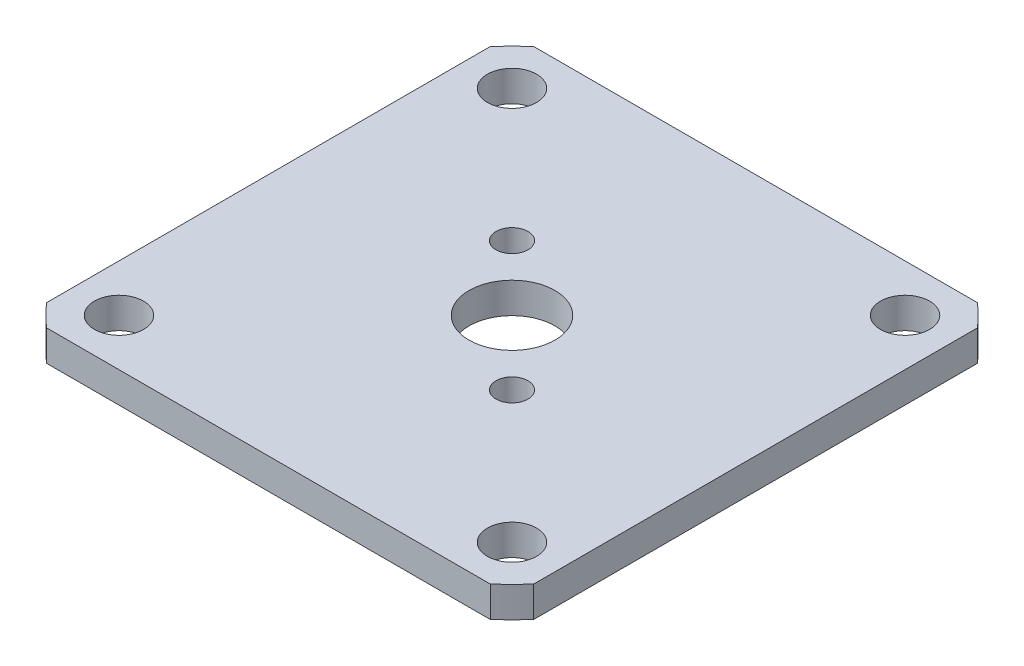
ISO-10303-21;
HEADER;
FILE_DESCRIPTION(('STEP AP214'),'2;1');
FILE_NAME('part.step','',(''),(''),'','','');
FILE_SCHEMA(('AUTOMOTIVE_DESIGN { 1 0 10303 214 1 1 1 1 }'));
ENDSEC;
DATA;
#1=APPLICATION_CONTEXT('core data for automotive mechanical design processes');
#2=APPLICATION_PROTOCOL_DEFINITION('international standard','automotive_design',2000,#1);
#3=PRODUCT_CONTEXT('',#1,'mechanical');
#4=PRODUCT('Part','Part','',(#3));
#5=PRODUCT_RELATED_PRODUCT_CATEGORY('part','',(#4));
#6=PRODUCT_DEFINITION_FORMATION('','',#4);
#7=PRODUCT_DEFINITION_CONTEXT('part definition',#1,'design');
#8=PRODUCT_DEFINITION('design','',#6,#7);
#9=PRODUCT_DEFINITION_SHAPE('','',#8);
#10=(LENGTH_UNIT() NAMED_UNIT(*) SI_UNIT(.MILLI.,.METRE.));
#11=(NAMED_UNIT(*) PLANE_ANGLE_UNIT() SI_UNIT($,.RADIAN.));
#12=(NAMED_UNIT(*) SI_UNIT($,.STERADIAN.) SOLID_ANGLE_UNIT());
#13=UNCERTAINTY_MEASURE_WITH_UNIT(LENGTH_MEASURE(1.E-05),#10,'distance_accuracy_value','');
#14=(GEOMETRIC_REPRESENTATION_CONTEXT(3) GLOBAL_UNCERTAINTY_ASSIGNED_CONTEXT((#13)) GLOBAL_UNIT_ASSIGNED_CONTEXT((#10,
#11,#12)) REPRESENTATION_CONTEXT('',''));
#15=CARTESIAN_POINT('',(0.,0.,0.));
#16=DIRECTION('',(0.,0.,1.));
#17=DIRECTION('',(1.,0.,0.));
#18=AXIS2_PLACEMENT_3D('',#15,#16,#17);
#19=CARTESIAN_POINT('',(0.,2.5,0.));
#20=DIRECTION('',(0.,-1.,0.));
#21=DIRECTION('',(0.,0.,-1.));
#22=AXIS2_PLACEMENT_3D('',#19,#20,#21);
#23=CYLINDRICAL_SURFACE('',#22,26.83);
#24=CARTESIAN_POINT('',(0.,2.5,0.));
#25=DIRECTION('',(0.,1.,0.));
#26=DIRECTION('',(0.,0.,1.));
#27=AXIS2_PLACEMENT_3D('',#24,#25,#26);
#28=CIRCLE('',#27,26.83);
#29=CARTESIAN_POINT('',(-19.8339359945665,2.5,18.0683115692485));
#30=VERTEX_POINT('',#29);
#31=CARTESIAN_POINT('',(-18.0683115692485,2.5,19.8339359945665));
#32=VERTEX_POINT('',#31);
#33=EDGE_CURVE('E122',#30,#32,#28,.T.);
#34=ORIENTED_EDGE('',*,*,#33,.F.);
#35=DIRECTION('',(0.,1.,0.));
#36=VECTOR('',#35,1.);
#37=CARTESIAN_POINT('',(-19.8339359945665,-7.5,18.0683115692485));
#38=LINE('',#37,#36);
#39=CARTESIAN_POINT('',(-19.8339359945665,0.,18.0683115692485));
#40=VERTEX_POINT('',#39);
#41=EDGE_CURVE('E106',#40,#30,#38,.T.);
#42=ORIENTED_EDGE('',*,*,#41,.F.);
#43=CARTESIAN_POINT('',(0.,0.,0.));
#44=DIRECTION('',(0.,1.,0.));
#45=DIRECTION('',(0.,0.,1.));
#46=AXIS2_PLACEMENT_3D('',#43,#44,#45);
#47=CIRCLE('',#46,26.83);
#48=CARTESIAN_POINT('',(-18.0683115692485,0.,19.8339359945665));
#49=VERTEX_POINT('',#48);
#50=EDGE_CURVE('E222',#40,#49,#47,.T.);
#51=ORIENTED_EDGE('',*,*,#50,.T.);
#52=DIRECTION('',(0.,1.,0.));
#53=VECTOR('',#52,1.);
#54=CARTESIAN_POINT('',(-18.0683115692485,-7.5,19.8339359945665));
#55=LINE('',#54,#53);
#56=EDGE_CURVE('E59',#49,#32,#55,.T.);
#57=ORIENTED_EDGE('',*,*,#56,.T.);
#58=EDGE_LOOP('',(#34,#42,#51,#57));
#59=FACE_BOUND('',#58,.T.);
#60=ADVANCED_FACE('F41',(#59),#23,.T.);
#61=CARTESIAN_POINT('',(-18.0683115692485,0.,-19.8339359945665));
#62=VERTEX_POINT('',#61);
#63=CARTESIAN_POINT('',(-19.8339359945665,0.,-18.0683115692485));
#64=VERTEX_POINT('',#63);
#65=EDGE_CURVE('E227',#62,#64,#47,.T.);
#66=ORIENTED_EDGE('',*,*,#65,.T.);
#67=DIRECTION('',(0.,1.,0.));
#68=VECTOR('',#67,1.);
#69=CARTESIAN_POINT('',(-19.8339359945665,-7.5,-18.0683115692485));
#70=LINE('',#69,#68);
#71=CARTESIAN_POINT('',(-19.8339359945665,2.5,-18.0683115692485));
#72=VERTEX_POINT('',#71);
#73=EDGE_CURVE('E67',#64,#72,#70,.T.);
#74=ORIENTED_EDGE('',*,*,#73,.T.);
#75=CARTESIAN_POINT('',(-18.0683115692485,2.5,-19.8339359945665));
#76=VERTEX_POINT('',#75);
#77=EDGE_CURVE('E125',#76,#72,#28,.T.);
#78=ORIENTED_EDGE('',*,*,#77,.F.);
#79=DIRECTION('',(0.,1.,0.));
#80=VECTOR('',#79,1.);
#81=CARTESIAN_POINT('',(-18.0683115692485,-7.5,-19.8339359945665));
#82=LINE('',#81,#80);
#83=EDGE_CURVE('E164',#62,#76,#82,.T.);
#84=ORIENTED_EDGE('',*,*,#83,.F.);
#85=EDGE_LOOP('',(#66,#74,#78,#84));
#86=FACE_BOUND('',#85,.T.);
#87=ADVANCED_FACE('F287',(#86),#23,.T.);
#88=DIRECTION('',(0.,1.,0.));
#89=VECTOR('',#88,1.);
#90=CARTESIAN_POINT('',(19.8339359945665,-7.5,18.0683115692485));
#91=LINE('',#90,#89);
#92=CARTESIAN_POINT('',(19.8339359945665,0.,18.0683115692485));
#93=VERTEX_POINT('',#92);
#94=CARTESIAN_POINT('',(19.8339359945665,2.5,18.0683115692485));
#95=VERTEX_POINT('',#94);
#96=EDGE_CURVE('E172',#93,#95,#91,.T.);
#97=ORIENTED_EDGE('',*,*,#96,.T.);
#98=CARTESIAN_POINT('',(18.0683115692485,2.5,19.8339359945665));
#99=VERTEX_POINT('',#98);
#100=EDGE_CURVE('E132',#99,#95,#28,.T.);
#101=ORIENTED_EDGE('',*,*,#100,.F.);
#102=DIRECTION('',(0.,1.,0.));
#103=VECTOR('',#102,1.);
#104=CARTESIAN_POINT('',(18.0683115692485,-7.5,19.8339359945665));
#105=LINE('',#104,#103);
#106=CARTESIAN_POINT('',(18.0683115692485,0.,19.8339359945665));
#107=VERTEX_POINT('',#106);
#108=EDGE_CURVE('E173',#107,#99,#105,.T.);
#109=ORIENTED_EDGE('',*,*,#108,.F.);
#110=EDGE_CURVE('E191',#107,#93,#47,.T.);
#111=ORIENTED_EDGE('',*,*,#110,.T.);
#112=EDGE_LOOP('',(#97,#101,#109,#111));
#113=FACE_BOUND('',#112,.T.);
#114=ADVANCED_FACE('F292',(#113),#23,.T.);
#115=CARTESIAN_POINT('',(19.8339359945665,0.,-18.0683115692485));
#116=VERTEX_POINT('',#115);
#117=CARTESIAN_POINT('',(18.0683115692485,0.,-19.8339359945665));
#118=VERTEX_POINT('',#117);
#119=EDGE_CURVE('E160',#116,#118,#47,.T.);
#120=ORIENTED_EDGE('',*,*,#119,.T.);
#121=DIRECTION('',(0.,1.,0.));
#122=VECTOR('',#121,1.);
#123=CARTESIAN_POINT('',(18.0683115692485,-7.5,-19.8339359945665));
#124=LINE('',#123,#122);
#125=CARTESIAN_POINT('',(18.0683115692485,2.5,-19.8339359945665));
#126=VERTEX_POINT('',#125);
#127=EDGE_CURVE('E127',#118,#126,#124,.T.);
#128=ORIENTED_EDGE('',*,*,#127,.T.);
#129=CARTESIAN_POINT('',(19.8339359945665,2.5,-18.0683115692485));
#130=VERTEX_POINT('',#129);
#131=EDGE_CURVE('E135',#130,#126,#28,.T.);
#132=ORIENTED_EDGE('',*,*,#131,.F.);
#133=DIRECTION('',(0.,1.,0.));
#134=VECTOR('',#133,1.);
#135=CARTESIAN_POINT('',(19.8339359945665,-7.5,-18.0683115692485));
#136=LINE('',#135,#134);
#137=EDGE_CURVE('E158',#116,#130,#136,.T.);
#138=ORIENTED_EDGE('',*,*,#137,.F.);
#139=EDGE_LOOP('',(#120,#128,#132,#138));
#140=FACE_BOUND('',#139,.T.);
#141=ADVANCED_FACE('F157',(#140),#23,.T.);
#142=CARTESIAN_POINT('',(0.,2.5,0.));
#143=DIRECTION('',(0.,1.,0.));
#144=DIRECTION('',(0.,0.,1.));
#145=AXIS2_PLACEMENT_3D('',#142,#143,#144);
#146=PLANE('',#145);
#147=CARTESIAN_POINT('',(-5.26243008694653,2.5,-5.26243008694652));
#148=DIRECTION('',(0.,1.,0.));
#149=DIRECTION('',(0.,0.,1.));
#150=AXIS2_PLACEMENT_3D('',#147,#148,#149);
#151=CIRCLE('',#150,1.3);
#152=CARTESIAN_POINT('',(-5.26243008694653,2.5,-3.96243008694652));
#153=VERTEX_POINT('',#152);
#154=EDGE_CURVE('E242',#153,#153,#151,.T.);
#155=ORIENTED_EDGE('',*,*,#154,.F.);
#156=EDGE_LOOP('',(#155));
#157=FACE_BOUND('',#156,.T.);
#158=CARTESIAN_POINT('',(5.26243008694652,2.5,5.26243008694652));
#159=DIRECTION('',(0.,1.,0.));
#160=DIRECTION('',(0.,0.,1.));
#161=AXIS2_PLACEMENT_3D('',#158,#159,#160);
#162=CIRCLE('',#161,1.3);
#163=CARTESIAN_POINT('',(5.26243008694652,2.5,6.56243008694652));
#164=VERTEX_POINT('',#163);
#165=EDGE_CURVE('E249',#164,#164,#162,.T.);
#166=ORIENTED_EDGE('',*,*,#165,.F.);
#167=EDGE_LOOP('',(#166));
#168=FACE_BOUND('',#167,.T.);
#169=DIRECTION('',(0.,0.,-1.));
#170=VECTOR('',#169,1.);
#171=CARTESIAN_POINT('',(-19.8339359945665,2.5,0.));
#172=LINE('',#171,#170);
#173=EDGE_CURVE('E109',#30,#72,#172,.T.);
#174=ORIENTED_EDGE('',*,*,#173,.F.);
#175=ORIENTED_EDGE('',*,*,#33,.T.);
#176=DIRECTION('',(1.,0.,0.));
#177=VECTOR('',#176,1.);
#178=CARTESIAN_POINT('',(0.,2.5,19.8339359945665));
#179=LINE('',#178,#177);
#180=EDGE_CURVE('E179',#32,#99,#179,.T.);
#181=ORIENTED_EDGE('',*,*,#180,.T.);
#182=ORIENTED_EDGE('',*,*,#100,.T.);
#183=DIRECTION('',(0.,0.,-1.));
#184=VECTOR('',#183,1.);
#185=CARTESIAN_POINT('',(19.8339359945665,2.5,0.));
#186=LINE('',#185,#184);
#187=EDGE_CURVE('E152',#95,#130,#186,.T.);
#188=ORIENTED_EDGE('',*,*,#187,.T.);
#189=ORIENTED_EDGE('',*,*,#131,.T.);
#190=DIRECTION('',(1.,0.,0.));
#191=VECTOR('',#190,1.);
#192=CARTESIAN_POINT('',(0.,2.5,-19.8339359945665));
#193=LINE('',#192,#191);
#194=EDGE_CURVE('E151',#76,#126,#193,.T.);
#195=ORIENTED_EDGE('',*,*,#194,.F.);
#196=ORIENTED_EDGE('',*,*,#77,.T.);
#197=EDGE_LOOP('',(#174,#175,#181,#182,#188,#189,#195,#196));
#198=FACE_BOUND('',#197,.T.);
#199=CARTESIAN_POINT('',(-16.0000000014358,2.5,16.0000000014358));
#200=DIRECTION('',(0.,1.,0.));
#201=DIRECTION('',(0.,0.,1.));
#202=AXIS2_PLACEMENT_3D('',#199,#200,#201);
#203=CIRCLE('',#202,2.);
#204=CARTESIAN_POINT('',(-16.0000000014358,2.5,18.0000000014358));
#205=VERTEX_POINT('',#204);
#206=EDGE_CURVE('E186',#205,#205,#203,.T.);
#207=ORIENTED_EDGE('',*,*,#206,.F.);
#208=EDGE_LOOP('',(#207));
#209=FACE_BOUND('',#208,.T.);
#210=CARTESIAN_POINT('',(16.0000000014358,2.5,-16.0000000014358));
#211=DIRECTION('',(0.,1.,0.));
#212=DIRECTION('',(0.,0.,1.));
#213=AXIS2_PLACEMENT_3D('',#210,#211,#212);
#214=CIRCLE('',#213,2.);
#215=CARTESIAN_POINT('',(16.0000000014358,2.5,-14.0000000014358));
#216=VERTEX_POINT('',#215);
#217=EDGE_CURVE('E190',#216,#216,#214,.T.);
#218=ORIENTED_EDGE('',*,*,#217,.F.);
#219=EDGE_LOOP('',(#218));
#220=FACE_BOUND('',#219,.T.);
#221=CARTESIAN_POINT('',(16.0000000014358,2.5,16.0000000014358));
#222=DIRECTION('',(0.,1.,0.));
#223=DIRECTION('',(0.,0.,1.));
#224=AXIS2_PLACEMENT_3D('',#221,#222,#223);
#225=CIRCLE('',#224,2.);
#226=CARTESIAN_POINT('',(16.0000000014358,2.5,18.0000000014358));
#227=VERTEX_POINT('',#226);
#228=EDGE_CURVE('E195',#227,#227,#225,.T.);
#229=ORIENTED_EDGE('',*,*,#228,.F.);
#230=EDGE_LOOP('',(#229));
#231=FACE_BOUND('',#230,.T.);
#232=CARTESIAN_POINT('',(-16.0000000014358,2.5,-16.0000000014358));
#233=DIRECTION('',(0.,1.,0.));
#234=DIRECTION('',(0.,0.,1.));
#235=AXIS2_PLACEMENT_3D('',#232,#233,#234);
#236=CIRCLE('',#235,2.);
#237=CARTESIAN_POINT('',(-16.0000000014358,2.5,-14.0000000014358));
#238=VERTEX_POINT('',#237);
#239=EDGE_CURVE('E137',#238,#238,#236,.T.);
#240=ORIENTED_EDGE('',*,*,#239,.F.);
#241=EDGE_LOOP('',(#240));
#242=FACE_BOUND('',#241,.T.);
#243=CARTESIAN_POINT('',(0.,2.5,0.));
#244=DIRECTION('',(0.,1.,0.));
#245=DIRECTION('',(0.,0.,1.));
#246=AXIS2_PLACEMENT_3D('',#243,#244,#245);
#247=CIRCLE('',#246,3.5);
#248=CARTESIAN_POINT('',(0.,2.5,3.5));
#249=VERTEX_POINT('',#248);
#250=EDGE_CURVE('E130',#249,#249,#247,.T.);
#251=ORIENTED_EDGE('',*,*,#250,.F.);
#252=EDGE_LOOP('',(#251));
#253=FACE_BOUND('',#252,.T.);
#254=ADVANCED_FACE('F119',(#157,#168,#198,#209,#220,#231,#242,#253),#146,.T.);
#255=CARTESIAN_POINT('',(0.,0.,0.));
#256=DIRECTION('',(0.,1.,0.));
#257=DIRECTION('',(0.,0.,1.));
#258=AXIS2_PLACEMENT_3D('',#255,#256,#257);
#259=PLANE('',#258);
#260=CARTESIAN_POINT('',(-5.26243008694653,0.,-5.26243008694652));
#261=DIRECTION('',(0.,1.,0.));
#262=DIRECTION('',(0.,0.,1.));
#263=AXIS2_PLACEMENT_3D('',#260,#261,#262);
#264=CIRCLE('',#263,1.3);
#265=CARTESIAN_POINT('',(-5.26243008694653,0.,-3.96243008694652));
#266=VERTEX_POINT('',#265);
#267=EDGE_CURVE('E45',#266,#266,#264,.T.);
#268=ORIENTED_EDGE('',*,*,#267,.T.);
#269=EDGE_LOOP('',(#268));
#270=FACE_BOUND('',#269,.T.);
#271=CARTESIAN_POINT('',(5.26243008694652,0.,5.26243008694652));
#272=DIRECTION('',(0.,1.,0.));
#273=DIRECTION('',(0.,0.,1.));
#274=AXIS2_PLACEMENT_3D('',#271,#272,#273);
#275=CIRCLE('',#274,1.3);
#276=CARTESIAN_POINT('',(5.26243008694652,0.,6.56243008694652));
#277=VERTEX_POINT('',#276);
#278=EDGE_CURVE('E239',#277,#277,#275,.T.);
#279=ORIENTED_EDGE('',*,*,#278,.T.);
#280=EDGE_LOOP('',(#279));
#281=FACE_BOUND('',#280,.T.);
#282=CARTESIAN_POINT('',(-16.0000000014358,0.,16.0000000014358));
#283=DIRECTION('',(0.,1.,0.));
#284=DIRECTION('',(0.,0.,1.));
#285=AXIS2_PLACEMENT_3D('',#282,#283,#284);
#286=CIRCLE('',#285,2.);
#287=CARTESIAN_POINT('',(-16.0000000014358,0.,18.0000000014358));
#288=VERTEX_POINT('',#287);
#289=EDGE_CURVE('E258',#288,#288,#286,.T.);
#290=ORIENTED_EDGE('',*,*,#289,.T.);
#291=EDGE_LOOP('',(#290));
#292=FACE_BOUND('',#291,.T.);
#293=CARTESIAN_POINT('',(16.0000000014358,0.,-16.0000000014358));
#294=DIRECTION('',(0.,1.,0.));
#295=DIRECTION('',(0.,0.,1.));
#296=AXIS2_PLACEMENT_3D('',#293,#294,#295);
#297=CIRCLE('',#296,2.);
#298=CARTESIAN_POINT('',(16.0000000014358,0.,-14.0000000014358));
#299=VERTEX_POINT('',#298);
#300=EDGE_CURVE('E263',#299,#299,#297,.T.);
#301=ORIENTED_EDGE('',*,*,#300,.T.);
#302=EDGE_LOOP('',(#301));
#303=FACE_BOUND('',#302,.T.);
#304=CARTESIAN_POINT('',(16.0000000014358,0.,16.0000000014358));
#305=DIRECTION('',(0.,1.,0.));
#306=DIRECTION('',(0.,0.,1.));
#307=AXIS2_PLACEMENT_3D('',#304,#305,#306);
#308=CIRCLE('',#307,2.);
#309=CARTESIAN_POINT('',(16.0000000014358,0.,18.0000000014358));
#310=VERTEX_POINT('',#309);
#311=EDGE_CURVE('E230',#310,#310,#308,.T.);
#312=ORIENTED_EDGE('',*,*,#311,.T.);
#313=EDGE_LOOP('',(#312));
#314=FACE_BOUND('',#313,.T.);
#315=CARTESIAN_POINT('',(-16.0000000014358,0.,-16.0000000014358));
#316=DIRECTION('',(0.,1.,0.));
#317=DIRECTION('',(0.,0.,1.));
#318=AXIS2_PLACEMENT_3D('',#315,#316,#317);
#319=CIRCLE('',#318,2.);
#320=CARTESIAN_POINT('',(-16.0000000014358,0.,-14.0000000014358));
#321=VERTEX_POINT('',#320);
#322=EDGE_CURVE('E223',#321,#321,#319,.T.);
#323=ORIENTED_EDGE('',*,*,#322,.T.);
#324=EDGE_LOOP('',(#323));
#325=FACE_BOUND('',#324,.T.);
#326=CARTESIAN_POINT('',(0.,0.,0.));
#327=DIRECTION('',(0.,1.,0.));
#328=DIRECTION('',(0.,0.,1.));
#329=AXIS2_PLACEMENT_3D('',#326,#327,#328);
#330=CIRCLE('',#329,3.5);
#331=CARTESIAN_POINT('',(0.,0.,3.5));
#332=VERTEX_POINT('',#331);
#333=EDGE_CURVE('E219',#332,#332,#330,.T.);
#334=ORIENTED_EDGE('',*,*,#333,.T.);
#335=EDGE_LOOP('',(#334));
#336=FACE_BOUND('',#335,.T.);
#337=ORIENTED_EDGE('',*,*,#50,.F.);
#338=DIRECTION('',(0.,0.,-1.));
#339=VECTOR('',#338,1.);
#340=CARTESIAN_POINT('',(-19.8339359945665,0.,0.));
#341=LINE('',#340,#339);
#342=EDGE_CURVE('E11',#40,#64,#341,.T.);
#343=ORIENTED_EDGE('',*,*,#342,.T.);
#344=ORIENTED_EDGE('',*,*,#65,.F.);
#345=DIRECTION('',(1.,0.,0.));
#346=VECTOR('',#345,1.);
#347=CARTESIAN_POINT('',(0.,0.,-19.8339359945665));
#348=LINE('',#347,#346);
#349=EDGE_CURVE('E51',#62,#118,#348,.T.);
#350=ORIENTED_EDGE('',*,*,#349,.T.);
#351=ORIENTED_EDGE('',*,*,#119,.F.);
#352=DIRECTION('',(0.,0.,-1.));
#353=VECTOR('',#352,1.);
#354=CARTESIAN_POINT('',(19.8339359945665,0.,0.));
#355=LINE('',#354,#353);
#356=EDGE_CURVE('E147',#93,#116,#355,.T.);
#357=ORIENTED_EDGE('',*,*,#356,.F.);
#358=ORIENTED_EDGE('',*,*,#110,.F.);
#359=DIRECTION('',(1.,0.,0.));
#360=VECTOR('',#359,1.);
#361=CARTESIAN_POINT('',(0.,0.,19.8339359945665));
#362=LINE('',#361,#360);
#363=EDGE_CURVE('E142',#49,#107,#362,.T.);
#364=ORIENTED_EDGE('',*,*,#363,.F.);
#365=EDGE_LOOP('',(#337,#343,#344,#350,#351,#357,#358,#364));
#366=FACE_BOUND('',#365,.T.);
#367=ADVANCED_FACE('F208',(#270,#281,#292,#303,#314,#325,#336,#366),#259,.F.);
#368=CARTESIAN_POINT('',(0.,2.5,0.));
#369=DIRECTION('',(0.,-1.,0.));
#370=DIRECTION('',(0.,0.,-1.));
#371=AXIS2_PLACEMENT_3D('',#368,#369,#370);
#372=CYLINDRICAL_SURFACE('',#371,3.5);
#373=ORIENTED_EDGE('',*,*,#250,.T.);
#374=EDGE_LOOP('',(#373));
#375=FACE_BOUND('',#374,.T.);
#376=ORIENTED_EDGE('',*,*,#333,.F.);
#377=EDGE_LOOP('',(#376));
#378=FACE_BOUND('',#377,.T.);
#379=ADVANCED_FACE('F213',(#375,#378),#372,.F.);
#380=CARTESIAN_POINT('',(-16.0000000014358,2.5,-16.0000000014358));
#381=DIRECTION('',(0.,-1.,0.));
#382=DIRECTION('',(0.,0.,-1.));
#383=AXIS2_PLACEMENT_3D('',#380,#381,#382);
#384=CYLINDRICAL_SURFACE('',#383,2.);
#385=ORIENTED_EDGE('',*,*,#239,.T.);
#386=EDGE_LOOP('',(#385));
#387=FACE_BOUND('',#386,.T.);
#388=ORIENTED_EDGE('',*,*,#322,.F.);
#389=EDGE_LOOP('',(#388));
#390=FACE_BOUND('',#389,.T.);
#391=ADVANCED_FACE('F203',(#387,#390),#384,.F.);
#392=CARTESIAN_POINT('',(16.0000000014358,2.5,16.0000000014358));
#393=DIRECTION('',(0.,-1.,0.));
#394=DIRECTION('',(0.,0.,-1.));
#395=AXIS2_PLACEMENT_3D('',#392,#393,#394);
#396=CYLINDRICAL_SURFACE('',#395,2.);
#397=ORIENTED_EDGE('',*,*,#228,.T.);
#398=EDGE_LOOP('',(#397));
#399=FACE_BOUND('',#398,.T.);
#400=ORIENTED_EDGE('',*,*,#311,.F.);
#401=EDGE_LOOP('',(#400));
#402=FACE_BOUND('',#401,.T.);
#403=ADVANCED_FACE('F275',(#399,#402),#396,.F.);
#404=CARTESIAN_POINT('',(16.0000000014358,2.5,-16.0000000014358));
#405=DIRECTION('',(0.,-1.,0.));
#406=DIRECTION('',(0.,0.,-1.));
#407=AXIS2_PLACEMENT_3D('',#404,#405,#406);
#408=CYLINDRICAL_SURFACE('',#407,2.);
#409=ORIENTED_EDGE('',*,*,#217,.T.);
#410=EDGE_LOOP('',(#409));
#411=FACE_BOUND('',#410,.T.);
#412=ORIENTED_EDGE('',*,*,#300,.F.);
#413=EDGE_LOOP('',(#412));
#414=FACE_BOUND('',#413,.T.);
#415=ADVANCED_FACE('F277',(#411,#414),#408,.F.);
#416=CARTESIAN_POINT('',(-16.0000000014358,2.5,16.0000000014358));
#417=DIRECTION('',(0.,-1.,0.));
#418=DIRECTION('',(0.,0.,-1.));
#419=AXIS2_PLACEMENT_3D('',#416,#417,#418);
#420=CYLINDRICAL_SURFACE('',#419,2.);
#421=ORIENTED_EDGE('',*,*,#206,.T.);
#422=EDGE_LOOP('',(#421));
#423=FACE_BOUND('',#422,.T.);
#424=ORIENTED_EDGE('',*,*,#289,.F.);
#425=EDGE_LOOP('',(#424));
#426=FACE_BOUND('',#425,.T.);
#427=ADVANCED_FACE('F43',(#423,#426),#420,.F.);
#428=CARTESIAN_POINT('',(0.,-7.5,19.8339359945665));
#429=DIRECTION('',(0.,0.,1.));
#430=DIRECTION('',(1.,0.,0.));
#431=AXIS2_PLACEMENT_3D('',#428,#429,#430);
#432=PLANE('',#431);
#433=ORIENTED_EDGE('',*,*,#363,.T.);
#434=ORIENTED_EDGE('',*,*,#108,.T.);
#435=ORIENTED_EDGE('',*,*,#180,.F.);
#436=ORIENTED_EDGE('',*,*,#56,.F.);
#437=EDGE_LOOP('',(#433,#434,#435,#436));
#438=FACE_BOUND('',#437,.T.);
#439=ADVANCED_FACE('F311',(#438),#432,.T.);
#440=CARTESIAN_POINT('',(19.8339359945665,-7.5,0.));
#441=DIRECTION('',(1.,0.,0.));
#442=DIRECTION('',(0.,0.,-1.));
#443=AXIS2_PLACEMENT_3D('',#440,#441,#442);
#444=PLANE('',#443);
#445=ORIENTED_EDGE('',*,*,#356,.T.);
#446=ORIENTED_EDGE('',*,*,#137,.T.);
#447=ORIENTED_EDGE('',*,*,#187,.F.);
#448=ORIENTED_EDGE('',*,*,#96,.F.);
#449=EDGE_LOOP('',(#445,#446,#447,#448));
#450=FACE_BOUND('',#449,.T.);
#451=ADVANCED_FACE('F305',(#450),#444,.T.);
#452=CARTESIAN_POINT('',(0.,-7.5,-19.8339359945665));
#453=DIRECTION('',(0.,0.,1.));
#454=DIRECTION('',(1.,0.,0.));
#455=AXIS2_PLACEMENT_3D('',#452,#453,#454);
#456=PLANE('',#455);
#457=ORIENTED_EDGE('',*,*,#83,.T.);
#458=ORIENTED_EDGE('',*,*,#194,.T.);
#459=ORIENTED_EDGE('',*,*,#127,.F.);
#460=ORIENTED_EDGE('',*,*,#349,.F.);
#461=EDGE_LOOP('',(#457,#458,#459,#460));
#462=FACE_BOUND('',#461,.T.);
#463=ADVANCED_FACE('F318',(#462),#456,.F.);
#464=CARTESIAN_POINT('',(-19.8339359945665,-7.5,0.));
#465=DIRECTION('',(1.,0.,0.));
#466=DIRECTION('',(0.,0.,-1.));
#467=AXIS2_PLACEMENT_3D('',#464,#465,#466);
#468=PLANE('',#467);
#469=ORIENTED_EDGE('',*,*,#41,.T.);
#470=ORIENTED_EDGE('',*,*,#173,.T.);
#471=ORIENTED_EDGE('',*,*,#73,.F.);
#472=ORIENTED_EDGE('',*,*,#342,.F.);
#473=EDGE_LOOP('',(#469,#470,#471,#472));
#474=FACE_BOUND('',#473,.T.);
#475=ADVANCED_FACE('F108',(#474),#468,.F.);
#476=CARTESIAN_POINT('',(5.26243008694652,-7.5,5.26243008694652));
#477=DIRECTION('',(0.,1.,0.));
#478=DIRECTION('',(0.,0.,1.));
#479=AXIS2_PLACEMENT_3D('',#476,#477,#478);
#480=CYLINDRICAL_SURFACE('',#479,1.3);
#481=ORIENTED_EDGE('',*,*,#165,.T.);
#482=EDGE_LOOP('',(#481));
#483=FACE_BOUND('',#482,.T.);
#484=ORIENTED_EDGE('',*,*,#278,.F.);
#485=EDGE_LOOP('',(#484));
#486=FACE_BOUND('',#485,.T.);
#487=ADVANCED_FACE('F333',(#483,#486),#480,.F.);
#488=CARTESIAN_POINT('',(-5.26243008694653,-7.5,-5.26243008694652));
#489=DIRECTION('',(0.,1.,0.));
#490=DIRECTION('',(0.,0.,1.));
#491=AXIS2_PLACEMENT_3D('',#488,#489,#490);
#492=CYLINDRICAL_SURFACE('',#491,1.3);
#493=ORIENTED_EDGE('',*,*,#154,.T.);
#494=EDGE_LOOP('',(#493));
#495=FACE_BOUND('',#494,.T.);
#496=ORIENTED_EDGE('',*,*,#267,.F.);
#497=EDGE_LOOP('',(#496));
#498=FACE_BOUND('',#497,.T.);
#499=ADVANCED_FACE('F331',(#495,#498),#492,.F.);
#500=CLOSED_SHELL('',(#60,#87,#114,#141,#254,#367,#379,#391,#403,#415,#427,#439,#451,#463,#475,
#487,#499));
#501=MANIFOLD_SOLID_BREP('B2',#500);
#502=ADVANCED_BREP_SHAPE_REPRESENTATION('',(#18,#501),#14);
#503=SHAPE_DEFINITION_REPRESENTATION(#9,#502);
ENDSEC;
END-ISO-10303-21;
